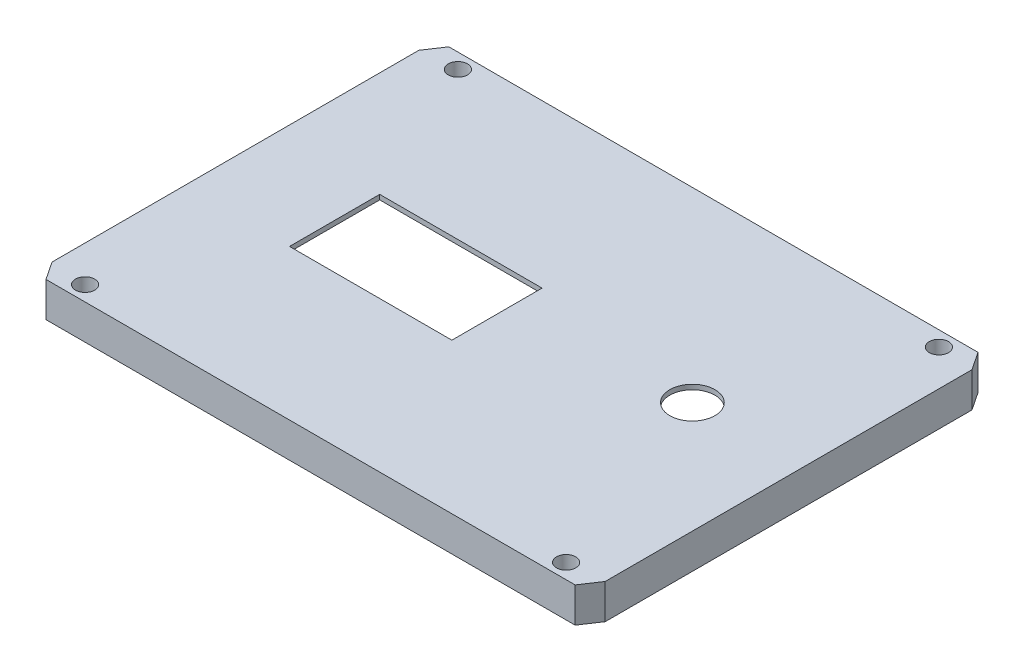
ISO-10303-21;
HEADER;
FILE_DESCRIPTION(('STEP AP214'),'2;1');
FILE_NAME('part.step','',(''),(''),'','','');
FILE_SCHEMA(('AUTOMOTIVE_DESIGN { 1 0 10303 214 1 1 1 1 }'));
ENDSEC;
DATA;
#1=APPLICATION_CONTEXT('core data for automotive mechanical design processes');
#2=APPLICATION_PROTOCOL_DEFINITION('international standard','automotive_design',2000,#1);
#3=PRODUCT_CONTEXT('',#1,'mechanical');
#4=PRODUCT('Part','Part','',(#3));
#5=PRODUCT_RELATED_PRODUCT_CATEGORY('part','',(#4));
#6=PRODUCT_DEFINITION_FORMATION('','',#4);
#7=PRODUCT_DEFINITION_CONTEXT('part definition',#1,'design');
#8=PRODUCT_DEFINITION('design','',#6,#7);
#9=PRODUCT_DEFINITION_SHAPE('','',#8);
#10=(LENGTH_UNIT() NAMED_UNIT(*) SI_UNIT(.MILLI.,.METRE.));
#11=(NAMED_UNIT(*) PLANE_ANGLE_UNIT() SI_UNIT($,.RADIAN.));
#12=(NAMED_UNIT(*) SI_UNIT($,.STERADIAN.) SOLID_ANGLE_UNIT());
#13=UNCERTAINTY_MEASURE_WITH_UNIT(LENGTH_MEASURE(1.E-05),#10,'distance_accuracy_value','');
#14=(GEOMETRIC_REPRESENTATION_CONTEXT(3) GLOBAL_UNCERTAINTY_ASSIGNED_CONTEXT((#13)) GLOBAL_UNIT_ASSIGNED_CONTEXT((#10,
#11,#12)) REPRESENTATION_CONTEXT('',''));
#15=CARTESIAN_POINT('',(0.,0.,0.));
#16=DIRECTION('',(0.,0.,1.));
#17=DIRECTION('',(1.,0.,0.));
#18=AXIS2_PLACEMENT_3D('',#15,#16,#17);
#19=CARTESIAN_POINT('',(40.,17.,-31.));
#20=DIRECTION('',(0.,1.,0.));
#21=DIRECTION('',(0.,0.,1.));
#22=AXIS2_PLACEMENT_3D('',#19,#20,#21);
#23=CYLINDRICAL_SURFACE('',#22,1.6);
#24=CARTESIAN_POINT('',(40.,25.8,-31.));
#25=DIRECTION('',(0.,1.,0.));
#26=DIRECTION('',(0.,0.,1.));
#27=AXIS2_PLACEMENT_3D('',#24,#25,#26);
#28=CIRCLE('',#27,1.6);
#29=CARTESIAN_POINT('',(40.,25.8,-29.4));
#30=VERTEX_POINT('',#29);
#31=EDGE_CURVE('E231',#30,#30,#28,.F.);
#32=ORIENTED_EDGE('',*,*,#31,.F.);
#33=EDGE_LOOP('',(#32));
#34=FACE_BOUND('',#33,.T.);
#35=CARTESIAN_POINT('',(40.,20.,-31.));
#36=DIRECTION('',(0.,-1.,0.));
#37=DIRECTION('',(0.,0.,-1.));
#38=AXIS2_PLACEMENT_3D('',#35,#36,#37);
#39=CIRCLE('',#38,1.6);
#40=CARTESIAN_POINT('',(40.,20.,-32.6));
#41=VERTEX_POINT('',#40);
#42=EDGE_CURVE('E260',#41,#41,#39,.F.);
#43=ORIENTED_EDGE('',*,*,#42,.F.);
#44=EDGE_LOOP('',(#43));
#45=FACE_BOUND('',#44,.T.);
#46=ADVANCED_FACE('F47',(#34,#45),#23,.F.);
#47=CARTESIAN_POINT('',(-40.,17.,-31.));
#48=DIRECTION('',(0.,1.,0.));
#49=DIRECTION('',(0.,0.,1.));
#50=AXIS2_PLACEMENT_3D('',#47,#48,#49);
#51=CYLINDRICAL_SURFACE('',#50,1.6);
#52=CARTESIAN_POINT('',(-40.,25.8,-31.));
#53=DIRECTION('',(0.,1.,0.));
#54=DIRECTION('',(0.,0.,1.));
#55=AXIS2_PLACEMENT_3D('',#52,#53,#54);
#56=CIRCLE('',#55,1.6);
#57=CARTESIAN_POINT('',(-40.,25.8,-29.4));
#58=VERTEX_POINT('',#57);
#59=EDGE_CURVE('E339',#58,#58,#56,.F.);
#60=ORIENTED_EDGE('',*,*,#59,.F.);
#61=EDGE_LOOP('',(#60));
#62=FACE_BOUND('',#61,.T.);
#63=CARTESIAN_POINT('',(-40.,20.,-31.));
#64=DIRECTION('',(0.,-1.,0.));
#65=DIRECTION('',(0.,0.,-1.));
#66=AXIS2_PLACEMENT_3D('',#63,#64,#65);
#67=CIRCLE('',#66,1.6);
#68=CARTESIAN_POINT('',(-40.,20.,-32.6));
#69=VERTEX_POINT('',#68);
#70=EDGE_CURVE('E393',#69,#69,#67,.F.);
#71=ORIENTED_EDGE('',*,*,#70,.F.);
#72=EDGE_LOOP('',(#71));
#73=FACE_BOUND('',#72,.T.);
#74=ADVANCED_FACE('F422',(#62,#73),#51,.F.);
#75=CARTESIAN_POINT('',(-40.,17.,31.));
#76=DIRECTION('',(0.,1.,0.));
#77=DIRECTION('',(0.,0.,1.));
#78=AXIS2_PLACEMENT_3D('',#75,#76,#77);
#79=CYLINDRICAL_SURFACE('',#78,1.6);
#80=CARTESIAN_POINT('',(-40.,25.8,31.));
#81=DIRECTION('',(0.,1.,0.));
#82=DIRECTION('',(0.,0.,1.));
#83=AXIS2_PLACEMENT_3D('',#80,#81,#82);
#84=CIRCLE('',#83,1.6);
#85=CARTESIAN_POINT('',(-40.,25.8,32.6));
#86=VERTEX_POINT('',#85);
#87=EDGE_CURVE('E224',#86,#86,#84,.F.);
#88=ORIENTED_EDGE('',*,*,#87,.F.);
#89=EDGE_LOOP('',(#88));
#90=FACE_BOUND('',#89,.T.);
#91=CARTESIAN_POINT('',(-40.,20.,31.));
#92=DIRECTION('',(0.,-1.,0.));
#93=DIRECTION('',(0.,0.,-1.));
#94=AXIS2_PLACEMENT_3D('',#91,#92,#93);
#95=CIRCLE('',#94,1.6);
#96=CARTESIAN_POINT('',(-40.,20.,29.4));
#97=VERTEX_POINT('',#96);
#98=EDGE_CURVE('E389',#97,#97,#95,.F.);
#99=ORIENTED_EDGE('',*,*,#98,.F.);
#100=EDGE_LOOP('',(#99));
#101=FACE_BOUND('',#100,.T.);
#102=ADVANCED_FACE('F408',(#90,#101),#79,.F.);
#103=CARTESIAN_POINT('',(40.,17.,31.));
#104=DIRECTION('',(0.,1.,0.));
#105=DIRECTION('',(0.,0.,1.));
#106=AXIS2_PLACEMENT_3D('',#103,#104,#105);
#107=CYLINDRICAL_SURFACE('',#106,1.6);
#108=CARTESIAN_POINT('',(40.,25.8,31.));
#109=DIRECTION('',(0.,1.,0.));
#110=DIRECTION('',(0.,0.,1.));
#111=AXIS2_PLACEMENT_3D('',#108,#109,#110);
#112=CIRCLE('',#111,1.6);
#113=CARTESIAN_POINT('',(40.,25.8,32.6));
#114=VERTEX_POINT('',#113);
#115=EDGE_CURVE('E276',#114,#114,#112,.F.);
#116=ORIENTED_EDGE('',*,*,#115,.F.);
#117=EDGE_LOOP('',(#116));
#118=FACE_BOUND('',#117,.T.);
#119=CARTESIAN_POINT('',(40.,20.,31.));
#120=DIRECTION('',(0.,-1.,0.));
#121=DIRECTION('',(0.,0.,-1.));
#122=AXIS2_PLACEMENT_3D('',#119,#120,#121);
#123=CIRCLE('',#122,1.6);
#124=CARTESIAN_POINT('',(40.,20.,29.4));
#125=VERTEX_POINT('',#124);
#126=EDGE_CURVE('E385',#125,#125,#123,.F.);
#127=ORIENTED_EDGE('',*,*,#126,.F.);
#128=EDGE_LOOP('',(#127));
#129=FACE_BOUND('',#128,.T.);
#130=ADVANCED_FACE('F405',(#118,#129),#107,.F.);
#131=CARTESIAN_POINT('',(44.,25.,-33.5));
#132=DIRECTION('',(-0.832050294337845,0.,0.554700196225227));
#133=DIRECTION('',(0.,-1.,0.));
#134=AXIS2_PLACEMENT_3D('',#131,#132,#133);
#135=PLANE('',#134);
#136=DIRECTION('',(0.,1.,0.));
#137=VECTOR('',#136,1.);
#138=CARTESIAN_POINT('',(46.,25.,-30.5));
#139=LINE('',#138,#137);
#140=CARTESIAN_POINT('',(46.,20.,-30.5));
#141=VERTEX_POINT('',#140);
#142=CARTESIAN_POINT('',(46.,25.8,-30.5));
#143=VERTEX_POINT('',#142);
#144=EDGE_CURVE('E191',#141,#143,#139,.T.);
#145=ORIENTED_EDGE('',*,*,#144,.F.);
#146=DIRECTION('',(0.554700196225227,0.,0.832050294337845));
#147=VECTOR('',#146,1.);
#148=CARTESIAN_POINT('',(44.,20.,-33.5));
#149=LINE('',#148,#147);
#150=CARTESIAN_POINT('',(44.,20.,-33.5));
#151=VERTEX_POINT('',#150);
#152=EDGE_CURVE('E363',#151,#141,#149,.T.);
#153=ORIENTED_EDGE('',*,*,#152,.F.);
#154=DIRECTION('',(0.,-1.,0.));
#155=VECTOR('',#154,1.);
#156=CARTESIAN_POINT('',(44.,25.,-33.5));
#157=LINE('',#156,#155);
#158=CARTESIAN_POINT('',(44.,25.8,-33.5));
#159=VERTEX_POINT('',#158);
#160=EDGE_CURVE('E321',#159,#151,#157,.T.);
#161=ORIENTED_EDGE('',*,*,#160,.F.);
#162=DIRECTION('',(-0.554700196225227,0.,-0.832050294337845));
#163=VECTOR('',#162,1.);
#164=CARTESIAN_POINT('',(45.923076923077,25.8,-30.6153846153845));
#165=LINE('',#164,#163);
#166=EDGE_CURVE('E334',#143,#159,#165,.T.);
#167=ORIENTED_EDGE('',*,*,#166,.F.);
#168=EDGE_LOOP('',(#145,#153,#161,#167));
#169=FACE_BOUND('',#168,.T.);
#170=ADVANCED_FACE('F335',(#169),#135,.F.);
#171=CARTESIAN_POINT('',(46.,25.,33.5));
#172=DIRECTION('',(-1.,0.,0.));
#173=DIRECTION('',(0.,0.,1.));
#174=AXIS2_PLACEMENT_3D('',#171,#172,#173);
#175=PLANE('',#174);
#176=DIRECTION('',(0.,0.,1.));
#177=VECTOR('',#176,1.);
#178=CARTESIAN_POINT('',(46.,20.,-30.5));
#179=LINE('',#178,#177);
#180=CARTESIAN_POINT('',(46.,20.,30.5));
#181=VERTEX_POINT('',#180);
#182=EDGE_CURVE('E329',#141,#181,#179,.T.);
#183=ORIENTED_EDGE('',*,*,#182,.F.);
#184=ORIENTED_EDGE('',*,*,#144,.T.);
#185=DIRECTION('',(0.,0.,-1.));
#186=VECTOR('',#185,1.);
#187=CARTESIAN_POINT('',(46.,25.8,0.));
#188=LINE('',#187,#186);
#189=CARTESIAN_POINT('',(46.,25.8,30.5));
#190=VERTEX_POINT('',#189);
#191=EDGE_CURVE('E221',#190,#143,#188,.T.);
#192=ORIENTED_EDGE('',*,*,#191,.F.);
#193=DIRECTION('',(0.,-1.,0.));
#194=VECTOR('',#193,1.);
#195=CARTESIAN_POINT('',(46.,25.,30.5));
#196=LINE('',#195,#194);
#197=EDGE_CURVE('E197',#190,#181,#196,.T.);
#198=ORIENTED_EDGE('',*,*,#197,.T.);
#199=EDGE_LOOP('',(#183,#184,#192,#198));
#200=FACE_BOUND('',#199,.T.);
#201=ADVANCED_FACE('F328',(#200),#175,.F.);
#202=CARTESIAN_POINT('',(46.,25.,30.5));
#203=DIRECTION('',(-0.832050294337845,0.,-0.554700196225227));
#204=DIRECTION('',(0.,-1.,0.));
#205=AXIS2_PLACEMENT_3D('',#202,#203,#204);
#206=PLANE('',#205);
#207=DIRECTION('',(0.,1.,0.));
#208=VECTOR('',#207,1.);
#209=CARTESIAN_POINT('',(44.,25.,33.5));
#210=LINE('',#209,#208);
#211=CARTESIAN_POINT('',(44.,20.,33.5));
#212=VERTEX_POINT('',#211);
#213=CARTESIAN_POINT('',(44.,25.8,33.5));
#214=VERTEX_POINT('',#213);
#215=EDGE_CURVE('E57',#212,#214,#210,.T.);
#216=ORIENTED_EDGE('',*,*,#215,.F.);
#217=DIRECTION('',(-0.554700196225227,0.,0.832050294337845));
#218=VECTOR('',#217,1.);
#219=CARTESIAN_POINT('',(46.,20.,30.5));
#220=LINE('',#219,#218);
#221=EDGE_CURVE('E370',#181,#212,#220,.T.);
#222=ORIENTED_EDGE('',*,*,#221,.F.);
#223=ORIENTED_EDGE('',*,*,#197,.F.);
#224=DIRECTION('',(0.554700196225227,0.,-0.832050294337845));
#225=VECTOR('',#224,1.);
#226=CARTESIAN_POINT('',(45.923076923077,25.8,30.6153846153845));
#227=LINE('',#226,#225);
#228=EDGE_CURVE('E216',#214,#190,#227,.T.);
#229=ORIENTED_EDGE('',*,*,#228,.F.);
#230=EDGE_LOOP('',(#216,#222,#223,#229));
#231=FACE_BOUND('',#230,.T.);
#232=ADVANCED_FACE('F50',(#231),#206,.F.);
#233=CARTESIAN_POINT('',(46.,25.,33.5));
#234=DIRECTION('',(0.,0.,-1.));
#235=DIRECTION('',(-1.,0.,0.));
#236=AXIS2_PLACEMENT_3D('',#233,#234,#235);
#237=PLANE('',#236);
#238=DIRECTION('',(-1.,0.,0.));
#239=VECTOR('',#238,1.);
#240=CARTESIAN_POINT('',(44.,20.,33.5));
#241=LINE('',#240,#239);
#242=CARTESIAN_POINT('',(-44.,20.,33.5));
#243=VERTEX_POINT('',#242);
#244=EDGE_CURVE('E165',#212,#243,#241,.T.);
#245=ORIENTED_EDGE('',*,*,#244,.F.);
#246=ORIENTED_EDGE('',*,*,#215,.T.);
#247=DIRECTION('',(1.,0.,0.));
#248=VECTOR('',#247,1.);
#249=CARTESIAN_POINT('',(0.,25.8,33.5));
#250=LINE('',#249,#248);
#251=CARTESIAN_POINT('',(-44.,25.8,33.5));
#252=VERTEX_POINT('',#251);
#253=EDGE_CURVE('E206',#252,#214,#250,.T.);
#254=ORIENTED_EDGE('',*,*,#253,.F.);
#255=DIRECTION('',(0.,-1.,0.));
#256=VECTOR('',#255,1.);
#257=CARTESIAN_POINT('',(-44.,25.,33.5));
#258=LINE('',#257,#256);
#259=EDGE_CURVE('E185',#252,#243,#258,.T.);
#260=ORIENTED_EDGE('',*,*,#259,.T.);
#261=EDGE_LOOP('',(#245,#246,#254,#260));
#262=FACE_BOUND('',#261,.T.);
#263=ADVANCED_FACE('F205',(#262),#237,.F.);
#264=CARTESIAN_POINT('',(-44.,25.,33.5));
#265=DIRECTION('',(0.832050294337843,0.,-0.55470019622523));
#266=DIRECTION('',(0.,-1.,0.));
#267=AXIS2_PLACEMENT_3D('',#264,#265,#266);
#268=PLANE('',#267);
#269=DIRECTION('',(0.,1.,0.));
#270=VECTOR('',#269,1.);
#271=CARTESIAN_POINT('',(-46.,25.,30.5));
#272=LINE('',#271,#270);
#273=CARTESIAN_POINT('',(-46.,20.,30.5));
#274=VERTEX_POINT('',#273);
#275=CARTESIAN_POINT('',(-46.,25.8,30.5));
#276=VERTEX_POINT('',#275);
#277=EDGE_CURVE('E175',#274,#276,#272,.T.);
#278=ORIENTED_EDGE('',*,*,#277,.F.);
#279=DIRECTION('',(-0.554700196225231,0.,-0.832050294337842));
#280=VECTOR('',#279,1.);
#281=CARTESIAN_POINT('',(-44.,20.,33.5));
#282=LINE('',#281,#280);
#283=EDGE_CURVE('E159',#243,#274,#282,.T.);
#284=ORIENTED_EDGE('',*,*,#283,.F.);
#285=ORIENTED_EDGE('',*,*,#259,.F.);
#286=DIRECTION('',(0.55470019622523,0.,0.832050294337843));
#287=VECTOR('',#286,1.);
#288=CARTESIAN_POINT('',(-45.9230769230769,25.8,30.6153846153847));
#289=LINE('',#288,#287);
#290=EDGE_CURVE('E183',#276,#252,#289,.T.);
#291=ORIENTED_EDGE('',*,*,#290,.F.);
#292=EDGE_LOOP('',(#278,#284,#285,#291));
#293=FACE_BOUND('',#292,.T.);
#294=ADVANCED_FACE('F181',(#293),#268,.F.);
#295=CARTESIAN_POINT('',(-46.,25.,33.5));
#296=DIRECTION('',(1.,0.,0.));
#297=DIRECTION('',(0.,0.,-1.));
#298=AXIS2_PLACEMENT_3D('',#295,#296,#297);
#299=PLANE('',#298);
#300=DIRECTION('',(0.,0.,-1.));
#301=VECTOR('',#300,1.);
#302=CARTESIAN_POINT('',(-46.,20.,30.5));
#303=LINE('',#302,#301);
#304=CARTESIAN_POINT('',(-46.,20.,-30.5));
#305=VERTEX_POINT('',#304);
#306=EDGE_CURVE('E163',#274,#305,#303,.T.);
#307=ORIENTED_EDGE('',*,*,#306,.F.);
#308=ORIENTED_EDGE('',*,*,#277,.T.);
#309=DIRECTION('',(0.,0.,1.));
#310=VECTOR('',#309,1.);
#311=CARTESIAN_POINT('',(-46.,25.8,0.));
#312=LINE('',#311,#310);
#313=CARTESIAN_POINT('',(-46.,25.8,-30.5));
#314=VERTEX_POINT('',#313);
#315=EDGE_CURVE('E352',#314,#276,#312,.T.);
#316=ORIENTED_EDGE('',*,*,#315,.F.);
#317=DIRECTION('',(0.,-1.,0.));
#318=VECTOR('',#317,1.);
#319=CARTESIAN_POINT('',(-46.,25.,-30.5));
#320=LINE('',#319,#318);
#321=EDGE_CURVE('E177',#314,#305,#320,.T.);
#322=ORIENTED_EDGE('',*,*,#321,.T.);
#323=EDGE_LOOP('',(#307,#308,#316,#322));
#324=FACE_BOUND('',#323,.T.);
#325=ADVANCED_FACE('F173',(#324),#299,.F.);
#326=CARTESIAN_POINT('',(-46.,25.,-30.5));
#327=DIRECTION('',(0.832050294337844,0.,0.554700196225228));
#328=DIRECTION('',(0.,-1.,0.));
#329=AXIS2_PLACEMENT_3D('',#326,#327,#328);
#330=PLANE('',#329);
#331=DIRECTION('',(0.,1.,0.));
#332=VECTOR('',#331,1.);
#333=CARTESIAN_POINT('',(-44.,25.,-33.5));
#334=LINE('',#333,#332);
#335=CARTESIAN_POINT('',(-44.,20.,-33.5));
#336=VERTEX_POINT('',#335);
#337=CARTESIAN_POINT('',(-44.,25.8,-33.5));
#338=VERTEX_POINT('',#337);
#339=EDGE_CURVE('E189',#336,#338,#334,.T.);
#340=ORIENTED_EDGE('',*,*,#339,.F.);
#341=DIRECTION('',(0.554700196225228,0.,-0.832050294337844));
#342=VECTOR('',#341,1.);
#343=CARTESIAN_POINT('',(-46.,20.,-30.5));
#344=LINE('',#343,#342);
#345=EDGE_CURVE('E64',#305,#336,#344,.T.);
#346=ORIENTED_EDGE('',*,*,#345,.F.);
#347=ORIENTED_EDGE('',*,*,#321,.F.);
#348=DIRECTION('',(-0.554700196225228,0.,0.832050294337844));
#349=VECTOR('',#348,1.);
#350=CARTESIAN_POINT('',(-45.923076923077,25.8,-30.6153846153846));
#351=LINE('',#350,#349);
#352=EDGE_CURVE('E343',#338,#314,#351,.T.);
#353=ORIENTED_EDGE('',*,*,#352,.F.);
#354=EDGE_LOOP('',(#340,#346,#347,#353));
#355=FACE_BOUND('',#354,.T.);
#356=ADVANCED_FACE('F358',(#355),#330,.F.);
#357=CARTESIAN_POINT('',(46.,25.,-33.5));
#358=DIRECTION('',(0.,0.,1.));
#359=DIRECTION('',(1.,0.,0.));
#360=AXIS2_PLACEMENT_3D('',#357,#358,#359);
#361=PLANE('',#360);
#362=DIRECTION('',(1.,0.,0.));
#363=VECTOR('',#362,1.);
#364=CARTESIAN_POINT('',(-44.,20.,-33.5));
#365=LINE('',#364,#363);
#366=EDGE_CURVE('E360',#336,#151,#365,.T.);
#367=ORIENTED_EDGE('',*,*,#366,.F.);
#368=ORIENTED_EDGE('',*,*,#339,.T.);
#369=DIRECTION('',(-1.,0.,0.));
#370=VECTOR('',#369,1.);
#371=CARTESIAN_POINT('',(0.,25.8,-33.5));
#372=LINE('',#371,#370);
#373=EDGE_CURVE('E338',#159,#338,#372,.T.);
#374=ORIENTED_EDGE('',*,*,#373,.F.);
#375=ORIENTED_EDGE('',*,*,#160,.T.);
#376=EDGE_LOOP('',(#367,#368,#374,#375));
#377=FACE_BOUND('',#376,.T.);
#378=ADVANCED_FACE('F441',(#377),#361,.F.);
#379=CARTESIAN_POINT('',(-44.,25.,-28.5));
#380=DIRECTION('',(1.,0.,0.));
#381=DIRECTION('',(0.,0.,-1.));
#382=AXIS2_PLACEMENT_3D('',#379,#380,#381);
#383=PLANE('',#382);
#384=DIRECTION('',(0.,-1.,0.));
#385=VECTOR('',#384,1.);
#386=CARTESIAN_POINT('',(-44.,25.,28.5));
#387=LINE('',#386,#385);
#388=CARTESIAN_POINT('',(-44.,25.,28.5));
#389=VERTEX_POINT('',#388);
#390=CARTESIAN_POINT('',(-44.,20.,28.5));
#391=VERTEX_POINT('',#390);
#392=EDGE_CURVE('E309',#389,#391,#387,.T.);
#393=ORIENTED_EDGE('',*,*,#392,.T.);
#394=DIRECTION('',(0.,0.,-1.));
#395=VECTOR('',#394,1.);
#396=CARTESIAN_POINT('',(-44.,20.,-28.5));
#397=LINE('',#396,#395);
#398=CARTESIAN_POINT('',(-44.,20.,-28.5));
#399=VERTEX_POINT('',#398);
#400=EDGE_CURVE('E381',#391,#399,#397,.T.);
#401=ORIENTED_EDGE('',*,*,#400,.T.);
#402=DIRECTION('',(0.,-1.,0.));
#403=VECTOR('',#402,1.);
#404=CARTESIAN_POINT('',(-44.,25.,-28.5));
#405=LINE('',#404,#403);
#406=CARTESIAN_POINT('',(-44.,25.,-28.5));
#407=VERTEX_POINT('',#406);
#408=EDGE_CURVE('E313',#407,#399,#405,.T.);
#409=ORIENTED_EDGE('',*,*,#408,.F.);
#410=DIRECTION('',(0.,0.,1.));
#411=VECTOR('',#410,1.);
#412=CARTESIAN_POINT('',(-44.,25.,-28.5));
#413=LINE('',#412,#411);
#414=EDGE_CURVE('E297',#407,#389,#413,.T.);
#415=ORIENTED_EDGE('',*,*,#414,.T.);
#416=EDGE_LOOP('',(#393,#401,#409,#415));
#417=FACE_BOUND('',#416,.T.);
#418=ADVANCED_FACE('F437',(#417),#383,.T.);
#419=CARTESIAN_POINT('',(-44.,25.,28.5));
#420=DIRECTION('',(0.,0.,-1.));
#421=DIRECTION('',(-1.,0.,0.));
#422=AXIS2_PLACEMENT_3D('',#419,#420,#421);
#423=PLANE('',#422);
#424=DIRECTION('',(0.,-1.,0.));
#425=VECTOR('',#424,1.);
#426=CARTESIAN_POINT('',(44.,25.,28.5));
#427=LINE('',#426,#425);
#428=CARTESIAN_POINT('',(44.,25.,28.5));
#429=VERTEX_POINT('',#428);
#430=CARTESIAN_POINT('',(44.,20.,28.5));
#431=VERTEX_POINT('',#430);
#432=EDGE_CURVE('E305',#429,#431,#427,.T.);
#433=ORIENTED_EDGE('',*,*,#432,.T.);
#434=DIRECTION('',(-1.,0.,0.));
#435=VECTOR('',#434,1.);
#436=CARTESIAN_POINT('',(-44.,20.,28.5));
#437=LINE('',#436,#435);
#438=EDGE_CURVE('E377',#431,#391,#437,.T.);
#439=ORIENTED_EDGE('',*,*,#438,.T.);
#440=ORIENTED_EDGE('',*,*,#392,.F.);
#441=DIRECTION('',(1.,0.,0.));
#442=VECTOR('',#441,1.);
#443=CARTESIAN_POINT('',(-44.,25.,28.5));
#444=LINE('',#443,#442);
#445=EDGE_CURVE('E301',#389,#429,#444,.T.);
#446=ORIENTED_EDGE('',*,*,#445,.T.);
#447=EDGE_LOOP('',(#433,#439,#440,#446));
#448=FACE_BOUND('',#447,.T.);
#449=ADVANCED_FACE('F433',(#448),#423,.T.);
#450=CARTESIAN_POINT('',(44.,25.,-28.5));
#451=DIRECTION('',(-1.,0.,0.));
#452=DIRECTION('',(0.,0.,1.));
#453=AXIS2_PLACEMENT_3D('',#450,#451,#452);
#454=PLANE('',#453);
#455=DIRECTION('',(0.,-1.,0.));
#456=VECTOR('',#455,1.);
#457=CARTESIAN_POINT('',(44.,25.,-28.5));
#458=LINE('',#457,#456);
#459=CARTESIAN_POINT('',(44.,25.,-28.5));
#460=VERTEX_POINT('',#459);
#461=CARTESIAN_POINT('',(44.,20.,-28.5));
#462=VERTEX_POINT('',#461);
#463=EDGE_CURVE('E317',#460,#462,#458,.T.);
#464=ORIENTED_EDGE('',*,*,#463,.T.);
#465=DIRECTION('',(0.,0.,1.));
#466=VECTOR('',#465,1.);
#467=CARTESIAN_POINT('',(44.,20.,-28.5));
#468=LINE('',#467,#466);
#469=EDGE_CURVE('E72',#462,#431,#468,.T.);
#470=ORIENTED_EDGE('',*,*,#469,.T.);
#471=ORIENTED_EDGE('',*,*,#432,.F.);
#472=DIRECTION('',(0.,0.,-1.));
#473=VECTOR('',#472,1.);
#474=CARTESIAN_POINT('',(44.,25.,-28.5));
#475=LINE('',#474,#473);
#476=EDGE_CURVE('E289',#429,#460,#475,.T.);
#477=ORIENTED_EDGE('',*,*,#476,.T.);
#478=EDGE_LOOP('',(#464,#470,#471,#477));
#479=FACE_BOUND('',#478,.T.);
#480=ADVANCED_FACE('F436',(#479),#454,.T.);
#481=CARTESIAN_POINT('',(-44.,25.,-28.5));
#482=DIRECTION('',(0.,0.,1.));
#483=DIRECTION('',(1.,0.,0.));
#484=AXIS2_PLACEMENT_3D('',#481,#482,#483);
#485=PLANE('',#484);
#486=ORIENTED_EDGE('',*,*,#408,.T.);
#487=DIRECTION('',(1.,0.,0.));
#488=VECTOR('',#487,1.);
#489=CARTESIAN_POINT('',(-44.,20.,-28.5));
#490=LINE('',#489,#488);
#491=EDGE_CURVE('E11',#399,#462,#490,.T.);
#492=ORIENTED_EDGE('',*,*,#491,.T.);
#493=ORIENTED_EDGE('',*,*,#463,.F.);
#494=DIRECTION('',(-1.,0.,0.));
#495=VECTOR('',#494,1.);
#496=CARTESIAN_POINT('',(-44.,25.,-28.5));
#497=LINE('',#496,#495);
#498=EDGE_CURVE('E293',#460,#407,#497,.T.);
#499=ORIENTED_EDGE('',*,*,#498,.T.);
#500=EDGE_LOOP('',(#486,#492,#493,#499));
#501=FACE_BOUND('',#500,.T.);
#502=ADVANCED_FACE('F443',(#501),#485,.T.);
#503=CARTESIAN_POINT('',(0.,25.8,-6.5));
#504=DIRECTION('',(0.,0.,-1.));
#505=DIRECTION('',(-1.,0.,0.));
#506=AXIS2_PLACEMENT_3D('',#503,#504,#505);
#507=PLANE('',#506);
#508=DIRECTION('',(1.,0.,0.));
#509=VECTOR('',#508,1.);
#510=CARTESIAN_POINT('',(0.,25.,-6.5));
#511=LINE('',#510,#509);
#512=CARTESIAN_POINT('',(-28.5,25.,-6.5));
#513=VERTEX_POINT('',#512);
#514=CARTESIAN_POINT('',(-1.50000000000002,25.,-6.5));
#515=VERTEX_POINT('',#514);
#516=EDGE_CURVE('E259',#513,#515,#511,.T.);
#517=ORIENTED_EDGE('',*,*,#516,.T.);
#518=DIRECTION('',(0.,-1.,0.));
#519=VECTOR('',#518,1.);
#520=CARTESIAN_POINT('',(-1.50000000000002,25.8,-6.5));
#521=LINE('',#520,#519);
#522=CARTESIAN_POINT('',(-1.50000000000002,25.8,-6.5));
#523=VERTEX_POINT('',#522);
#524=EDGE_CURVE('E285',#523,#515,#521,.T.);
#525=ORIENTED_EDGE('',*,*,#524,.F.);
#526=DIRECTION('',(1.,0.,0.));
#527=VECTOR('',#526,1.);
#528=CARTESIAN_POINT('',(0.,25.8,-6.5));
#529=LINE('',#528,#527);
#530=CARTESIAN_POINT('',(-28.5,25.8,-6.5));
#531=VERTEX_POINT('',#530);
#532=EDGE_CURVE('E239',#531,#523,#529,.T.);
#533=ORIENTED_EDGE('',*,*,#532,.F.);
#534=DIRECTION('',(0.,-1.,0.));
#535=VECTOR('',#534,1.);
#536=CARTESIAN_POINT('',(-28.5,25.8,-6.5));
#537=LINE('',#536,#535);
#538=EDGE_CURVE('E254',#531,#513,#537,.T.);
#539=ORIENTED_EDGE('',*,*,#538,.T.);
#540=EDGE_LOOP('',(#517,#525,#533,#539));
#541=FACE_BOUND('',#540,.T.);
#542=ADVANCED_FACE('F446',(#541),#507,.F.);
#543=CARTESIAN_POINT('',(-1.50000000000001,25.8,0.));
#544=DIRECTION('',(1.,0.,0.));
#545=DIRECTION('',(0.,0.,-1.));
#546=AXIS2_PLACEMENT_3D('',#543,#544,#545);
#547=PLANE('',#546);
#548=DIRECTION('',(0.,0.,1.));
#549=VECTOR('',#548,1.);
#550=CARTESIAN_POINT('',(-1.50000000000001,25.,0.));
#551=LINE('',#550,#549);
#552=CARTESIAN_POINT('',(-1.50000000000001,25.,8.5));
#553=VERTEX_POINT('',#552);
#554=EDGE_CURVE('E264',#515,#553,#551,.T.);
#555=ORIENTED_EDGE('',*,*,#554,.T.);
#556=DIRECTION('',(0.,-1.,0.));
#557=VECTOR('',#556,1.);
#558=CARTESIAN_POINT('',(-1.50000000000001,25.8,8.5));
#559=LINE('',#558,#557);
#560=CARTESIAN_POINT('',(-1.50000000000001,25.8,8.5));
#561=VERTEX_POINT('',#560);
#562=EDGE_CURVE('E282',#561,#553,#559,.T.);
#563=ORIENTED_EDGE('',*,*,#562,.F.);
#564=DIRECTION('',(0.,0.,1.));
#565=VECTOR('',#564,1.);
#566=CARTESIAN_POINT('',(-1.50000000000001,25.8,0.));
#567=LINE('',#566,#565);
#568=EDGE_CURVE('E243',#523,#561,#567,.T.);
#569=ORIENTED_EDGE('',*,*,#568,.F.);
#570=ORIENTED_EDGE('',*,*,#524,.T.);
#571=EDGE_LOOP('',(#555,#563,#569,#570));
#572=FACE_BOUND('',#571,.T.);
#573=ADVANCED_FACE('F504',(#572),#547,.F.);
#574=CARTESIAN_POINT('',(0.,25.8,8.5));
#575=DIRECTION('',(0.,0.,-1.));
#576=DIRECTION('',(-1.,0.,0.));
#577=AXIS2_PLACEMENT_3D('',#574,#575,#576);
#578=PLANE('',#577);
#579=DIRECTION('',(1.,0.,0.));
#580=VECTOR('',#579,1.);
#581=CARTESIAN_POINT('',(0.,25.,8.5));
#582=LINE('',#581,#580);
#583=CARTESIAN_POINT('',(-28.5,25.,8.5));
#584=VERTEX_POINT('',#583);
#585=EDGE_CURVE('E268',#584,#553,#582,.T.);
#586=ORIENTED_EDGE('',*,*,#585,.F.);
#587=DIRECTION('',(0.,-1.,0.));
#588=VECTOR('',#587,1.);
#589=CARTESIAN_POINT('',(-28.5,25.8,8.5));
#590=LINE('',#589,#588);
#591=CARTESIAN_POINT('',(-28.5,25.8,8.5));
#592=VERTEX_POINT('',#591);
#593=EDGE_CURVE('E279',#592,#584,#590,.T.);
#594=ORIENTED_EDGE('',*,*,#593,.F.);
#595=DIRECTION('',(1.,0.,0.));
#596=VECTOR('',#595,1.);
#597=CARTESIAN_POINT('',(0.,25.8,8.5));
#598=LINE('',#597,#596);
#599=EDGE_CURVE('E246',#592,#561,#598,.T.);
#600=ORIENTED_EDGE('',*,*,#599,.T.);
#601=ORIENTED_EDGE('',*,*,#562,.T.);
#602=EDGE_LOOP('',(#586,#594,#600,#601));
#603=FACE_BOUND('',#602,.T.);
#604=ADVANCED_FACE('F512',(#603),#578,.T.);
#605=CARTESIAN_POINT('',(27.5,25.8,-2.5));
#606=DIRECTION('',(0.,-1.,0.));
#607=DIRECTION('',(0.,0.,-1.));
#608=AXIS2_PLACEMENT_3D('',#605,#606,#607);
#609=CYLINDRICAL_SURFACE('',#608,3.75000000000001);
#610=CARTESIAN_POINT('',(27.5,25.8,-2.5));
#611=DIRECTION('',(0.,1.,0.));
#612=DIRECTION('',(0.,0.,1.));
#613=AXIS2_PLACEMENT_3D('',#610,#611,#612);
#614=CIRCLE('',#613,3.75000000000001);
#615=CARTESIAN_POINT('',(27.5,25.8,1.25000000000002));
#616=VERTEX_POINT('',#615);
#617=EDGE_CURVE('E235',#616,#616,#614,.T.);
#618=ORIENTED_EDGE('',*,*,#617,.T.);
#619=EDGE_LOOP('',(#618));
#620=FACE_BOUND('',#619,.T.);
#621=CARTESIAN_POINT('',(27.5,25.,-2.5));
#622=DIRECTION('',(0.,1.,0.));
#623=DIRECTION('',(0.,0.,1.));
#624=AXIS2_PLACEMENT_3D('',#621,#622,#623);
#625=CIRCLE('',#624,3.75000000000001);
#626=CARTESIAN_POINT('',(27.5,25.,1.25000000000002));
#627=VERTEX_POINT('',#626);
#628=EDGE_CURVE('E255',#627,#627,#625,.T.);
#629=ORIENTED_EDGE('',*,*,#628,.F.);
#630=EDGE_LOOP('',(#629));
#631=FACE_BOUND('',#630,.T.);
#632=ADVANCED_FACE('F520',(#620,#631),#609,.F.);
#633=CARTESIAN_POINT('',(-28.5,25.8,0.));
#634=DIRECTION('',(1.,0.,0.));
#635=DIRECTION('',(0.,0.,-1.));
#636=AXIS2_PLACEMENT_3D('',#633,#634,#635);
#637=PLANE('',#636);
#638=DIRECTION('',(0.,0.,1.));
#639=VECTOR('',#638,1.);
#640=CARTESIAN_POINT('',(-28.5,25.,0.));
#641=LINE('',#640,#639);
#642=EDGE_CURVE('E272',#513,#584,#641,.T.);
#643=ORIENTED_EDGE('',*,*,#642,.F.);
#644=ORIENTED_EDGE('',*,*,#538,.F.);
#645=DIRECTION('',(0.,0.,1.));
#646=VECTOR('',#645,1.);
#647=CARTESIAN_POINT('',(-28.5,25.8,0.));
#648=LINE('',#647,#646);
#649=EDGE_CURVE('E250',#531,#592,#648,.T.);
#650=ORIENTED_EDGE('',*,*,#649,.T.);
#651=ORIENTED_EDGE('',*,*,#593,.T.);
#652=EDGE_LOOP('',(#643,#644,#650,#651));
#653=FACE_BOUND('',#652,.T.);
#654=ADVANCED_FACE('F528',(#653),#637,.T.);
#655=CARTESIAN_POINT('',(0.,25.8,0.));
#656=DIRECTION('',(0.,1.,0.));
#657=DIRECTION('',(0.,0.,1.));
#658=AXIS2_PLACEMENT_3D('',#655,#656,#657);
#659=PLANE('',#658);
#660=ORIENTED_EDGE('',*,*,#115,.T.);
#661=EDGE_LOOP('',(#660));
#662=FACE_BOUND('',#661,.T.);
#663=ORIENTED_EDGE('',*,*,#59,.T.);
#664=EDGE_LOOP('',(#663));
#665=FACE_BOUND('',#664,.T.);
#666=ORIENTED_EDGE('',*,*,#166,.T.);
#667=ORIENTED_EDGE('',*,*,#373,.T.);
#668=ORIENTED_EDGE('',*,*,#352,.T.);
#669=ORIENTED_EDGE('',*,*,#315,.T.);
#670=ORIENTED_EDGE('',*,*,#290,.T.);
#671=ORIENTED_EDGE('',*,*,#253,.T.);
#672=ORIENTED_EDGE('',*,*,#228,.T.);
#673=ORIENTED_EDGE('',*,*,#191,.T.);
#674=EDGE_LOOP('',(#666,#667,#668,#669,#670,#671,#672,#673));
#675=FACE_BOUND('',#674,.T.);
#676=ORIENTED_EDGE('',*,*,#87,.T.);
#677=EDGE_LOOP('',(#676));
#678=FACE_BOUND('',#677,.T.);
#679=ORIENTED_EDGE('',*,*,#31,.T.);
#680=EDGE_LOOP('',(#679));
#681=FACE_BOUND('',#680,.T.);
#682=ORIENTED_EDGE('',*,*,#617,.F.);
#683=EDGE_LOOP('',(#682));
#684=FACE_BOUND('',#683,.T.);
#685=ORIENTED_EDGE('',*,*,#532,.T.);
#686=ORIENTED_EDGE('',*,*,#568,.T.);
#687=ORIENTED_EDGE('',*,*,#599,.F.);
#688=ORIENTED_EDGE('',*,*,#649,.F.);
#689=EDGE_LOOP('',(#685,#686,#687,#688));
#690=FACE_BOUND('',#689,.T.);
#691=ADVANCED_FACE('F213',(#662,#665,#675,#678,#681,#684,#690),#659,.T.);
#692=CARTESIAN_POINT('',(0.,25.,0.));
#693=DIRECTION('',(0.,1.,0.));
#694=DIRECTION('',(0.,0.,1.));
#695=AXIS2_PLACEMENT_3D('',#692,#693,#694);
#696=PLANE('',#695);
#697=ORIENTED_EDGE('',*,*,#498,.F.);
#698=ORIENTED_EDGE('',*,*,#476,.F.);
#699=ORIENTED_EDGE('',*,*,#445,.F.);
#700=ORIENTED_EDGE('',*,*,#414,.F.);
#701=EDGE_LOOP('',(#697,#698,#699,#700));
#702=FACE_BOUND('',#701,.T.);
#703=ORIENTED_EDGE('',*,*,#628,.T.);
#704=EDGE_LOOP('',(#703));
#705=FACE_BOUND('',#704,.T.);
#706=ORIENTED_EDGE('',*,*,#516,.F.);
#707=ORIENTED_EDGE('',*,*,#642,.T.);
#708=ORIENTED_EDGE('',*,*,#585,.T.);
#709=ORIENTED_EDGE('',*,*,#554,.F.);
#710=EDGE_LOOP('',(#706,#707,#708,#709));
#711=FACE_BOUND('',#710,.T.);
#712=ADVANCED_FACE('F413',(#702,#705,#711),#696,.F.);
#713=CARTESIAN_POINT('',(0.,20.,0.));
#714=DIRECTION('',(0.,-1.,0.));
#715=DIRECTION('',(0.,0.,-1.));
#716=AXIS2_PLACEMENT_3D('',#713,#714,#715);
#717=PLANE('',#716);
#718=ORIENTED_EDGE('',*,*,#438,.F.);
#719=ORIENTED_EDGE('',*,*,#469,.F.);
#720=ORIENTED_EDGE('',*,*,#491,.F.);
#721=ORIENTED_EDGE('',*,*,#400,.F.);
#722=EDGE_LOOP('',(#718,#719,#720,#721));
#723=FACE_BOUND('',#722,.T.);
#724=ORIENTED_EDGE('',*,*,#283,.T.);
#725=ORIENTED_EDGE('',*,*,#306,.T.);
#726=ORIENTED_EDGE('',*,*,#345,.T.);
#727=ORIENTED_EDGE('',*,*,#366,.T.);
#728=ORIENTED_EDGE('',*,*,#152,.T.);
#729=ORIENTED_EDGE('',*,*,#182,.T.);
#730=ORIENTED_EDGE('',*,*,#221,.T.);
#731=ORIENTED_EDGE('',*,*,#244,.T.);
#732=EDGE_LOOP('',(#724,#725,#726,#727,#728,#729,#730,#731));
#733=FACE_BOUND('',#732,.T.);
#734=ORIENTED_EDGE('',*,*,#126,.T.);
#735=EDGE_LOOP('',(#734));
#736=FACE_BOUND('',#735,.T.);
#737=ORIENTED_EDGE('',*,*,#98,.T.);
#738=EDGE_LOOP('',(#737));
#739=FACE_BOUND('',#738,.T.);
#740=ORIENTED_EDGE('',*,*,#70,.T.);
#741=EDGE_LOOP('',(#740));
#742=FACE_BOUND('',#741,.T.);
#743=ORIENTED_EDGE('',*,*,#42,.T.);
#744=EDGE_LOOP('',(#743));
#745=FACE_BOUND('',#744,.T.);
#746=ADVANCED_FACE('F161',(#723,#733,#736,#739,#742,#745),#717,.T.);
#747=CLOSED_SHELL('',(#46,#74,#102,#130,#170,#201,#232,#263,#294,#325,#356,#378,#418,#449,#480,
#502,#542,#573,#604,#632,#654,#691,#712,#746));
#748=MANIFOLD_SOLID_BREP('B2',#747);
#749=ADVANCED_BREP_SHAPE_REPRESENTATION('',(#18,#748),#14);
#750=SHAPE_DEFINITION_REPRESENTATION(#9,#749);
ENDSEC;
END-ISO-10303-21;
